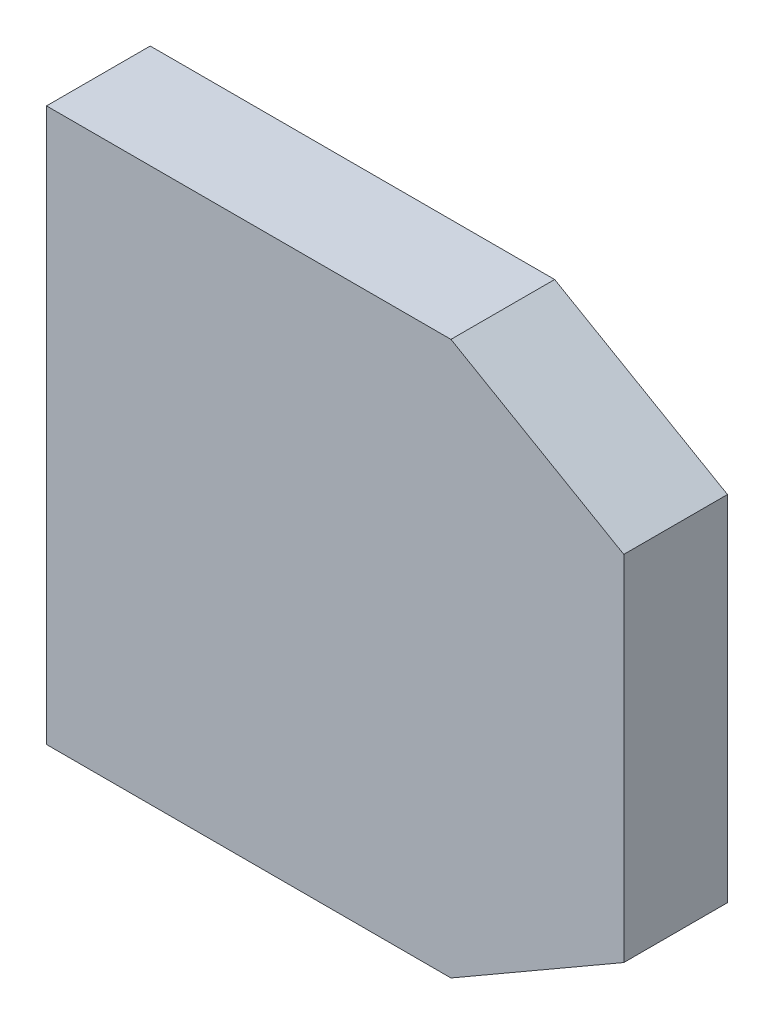
ISO-10303-21;
HEADER;
FILE_DESCRIPTION(('STEP AP214'),'2;1');
FILE_NAME('part.step','',(''),(''),'','','');
FILE_SCHEMA(('AUTOMOTIVE_DESIGN { 1 0 10303 214 1 1 1 1 }'));
ENDSEC;
DATA;
#1=APPLICATION_CONTEXT('core data for automotive mechanical design processes');
#2=APPLICATION_PROTOCOL_DEFINITION('international standard','automotive_design',2000,#1);
#3=PRODUCT_CONTEXT('',#1,'mechanical');
#4=PRODUCT('Part','Part','',(#3));
#5=PRODUCT_RELATED_PRODUCT_CATEGORY('part','',(#4));
#6=PRODUCT_DEFINITION_FORMATION('','',#4);
#7=PRODUCT_DEFINITION_CONTEXT('part definition',#1,'design');
#8=PRODUCT_DEFINITION('design','',#6,#7);
#9=PRODUCT_DEFINITION_SHAPE('','',#8);
#10=(LENGTH_UNIT() NAMED_UNIT(*) SI_UNIT(.MILLI.,.METRE.));
#11=(NAMED_UNIT(*) PLANE_ANGLE_UNIT() SI_UNIT($,.RADIAN.));
#12=(NAMED_UNIT(*) SI_UNIT($,.STERADIAN.) SOLID_ANGLE_UNIT());
#13=UNCERTAINTY_MEASURE_WITH_UNIT(LENGTH_MEASURE(1.E-05),#10,'distance_accuracy_value','');
#14=(GEOMETRIC_REPRESENTATION_CONTEXT(3) GLOBAL_UNCERTAINTY_ASSIGNED_CONTEXT((#13)) GLOBAL_UNIT_ASSIGNED_CONTEXT((#10,
#11,#12)) REPRESENTATION_CONTEXT('',''));
#15=CARTESIAN_POINT('',(0.,0.,0.));
#16=DIRECTION('',(0.,0.,1.));
#17=DIRECTION('',(1.,0.,0.));
#18=AXIS2_PLACEMENT_3D('',#15,#16,#17);
#19=CARTESIAN_POINT('',(0.,0.,0.));
#20=DIRECTION('',(0.,0.,1.));
#21=DIRECTION('',(1.,0.,0.));
#22=AXIS2_PLACEMENT_3D('',#19,#20,#21);
#23=PLANE('',#22);
#24=DIRECTION('',(0.,-1.,0.));
#25=VECTOR('',#24,1.);
#26=CARTESIAN_POINT('',(3.3000000000006,8.,0.));
#27=LINE('',#26,#25);
#28=CARTESIAN_POINT('',(3.3000000000006,8.,0.));
#29=VERTEX_POINT('',#28);
#30=CARTESIAN_POINT('',(3.3000000000006,-8.,0.));
#31=VERTEX_POINT('',#30);
#32=EDGE_CURVE('E100',#29,#31,#27,.T.);
#33=ORIENTED_EDGE('',*,*,#32,.F.);
#34=DIRECTION('',(-1.,0.,0.));
#35=VECTOR('',#34,1.);
#36=CARTESIAN_POINT('',(15.0000000000005,8.,0.));
#37=LINE('',#36,#35);
#38=CARTESIAN_POINT('',(15.0000000000005,8.,0.));
#39=VERTEX_POINT('',#38);
#40=EDGE_CURVE('E26',#39,#29,#37,.T.);
#41=ORIENTED_EDGE('',*,*,#40,.F.);
#42=DIRECTION('',(-0.86602540378444,0.5,0.));
#43=VECTOR('',#42,1.);
#44=CARTESIAN_POINT('',(20.0000000000006,5.11324865405187,0.));
#45=LINE('',#44,#43);
#46=CARTESIAN_POINT('',(20.0000000000006,5.11324865405187,0.));
#47=VERTEX_POINT('',#46);
#48=EDGE_CURVE('E117',#47,#39,#45,.T.);
#49=ORIENTED_EDGE('',*,*,#48,.F.);
#50=DIRECTION('',(0.,1.,0.));
#51=VECTOR('',#50,1.);
#52=CARTESIAN_POINT('',(20.0000000000006,-5.11324865405188,0.));
#53=LINE('',#52,#51);
#54=CARTESIAN_POINT('',(20.0000000000006,-5.11324865405188,0.));
#55=VERTEX_POINT('',#54);
#56=EDGE_CURVE('E147',#55,#47,#53,.T.);
#57=ORIENTED_EDGE('',*,*,#56,.F.);
#58=DIRECTION('',(0.866025403784441,0.5,0.));
#59=VECTOR('',#58,1.);
#60=CARTESIAN_POINT('',(15.0000000000005,-8.,0.));
#61=LINE('',#60,#59);
#62=CARTESIAN_POINT('',(15.0000000000005,-8.,0.));
#63=VERTEX_POINT('',#62);
#64=EDGE_CURVE('E135',#63,#55,#61,.T.);
#65=ORIENTED_EDGE('',*,*,#64,.F.);
#66=DIRECTION('',(1.,0.,0.));
#67=VECTOR('',#66,1.);
#68=CARTESIAN_POINT('',(3.3000000000006,-8.,0.));
#69=LINE('',#68,#67);
#70=EDGE_CURVE('E104',#31,#63,#69,.T.);
#71=ORIENTED_EDGE('',*,*,#70,.F.);
#72=EDGE_LOOP('',(#33,#41,#49,#57,#65,#71));
#73=FACE_BOUND('',#72,.T.);
#74=ADVANCED_FACE('F17',(#73),#23,.F.);
#75=CARTESIAN_POINT('',(0.,0.,3.));
#76=DIRECTION('',(0.,0.,1.));
#77=DIRECTION('',(1.,0.,0.));
#78=AXIS2_PLACEMENT_3D('',#75,#76,#77);
#79=PLANE('',#78);
#80=DIRECTION('',(0.,-1.,0.));
#81=VECTOR('',#80,1.);
#82=CARTESIAN_POINT('',(3.3000000000006,8.,3.));
#83=LINE('',#82,#81);
#84=CARTESIAN_POINT('',(3.3000000000006,8.,3.));
#85=VERTEX_POINT('',#84);
#86=CARTESIAN_POINT('',(3.3000000000006,-8.,3.));
#87=VERTEX_POINT('',#86);
#88=EDGE_CURVE('E102',#85,#87,#83,.T.);
#89=ORIENTED_EDGE('',*,*,#88,.T.);
#90=DIRECTION('',(1.,0.,0.));
#91=VECTOR('',#90,1.);
#92=CARTESIAN_POINT('',(3.3000000000006,-8.,3.));
#93=LINE('',#92,#91);
#94=CARTESIAN_POINT('',(15.0000000000005,-8.,3.));
#95=VERTEX_POINT('',#94);
#96=EDGE_CURVE('E127',#87,#95,#93,.T.);
#97=ORIENTED_EDGE('',*,*,#96,.T.);
#98=DIRECTION('',(0.866025403784441,0.5,0.));
#99=VECTOR('',#98,1.);
#100=CARTESIAN_POINT('',(15.0000000000005,-8.,3.));
#101=LINE('',#100,#99);
#102=CARTESIAN_POINT('',(20.0000000000006,-5.11324865405188,3.));
#103=VERTEX_POINT('',#102);
#104=EDGE_CURVE('E142',#95,#103,#101,.T.);
#105=ORIENTED_EDGE('',*,*,#104,.T.);
#106=DIRECTION('',(0.,1.,0.));
#107=VECTOR('',#106,1.);
#108=CARTESIAN_POINT('',(20.0000000000006,-5.11324865405188,3.));
#109=LINE('',#108,#107);
#110=CARTESIAN_POINT('',(20.0000000000006,5.11324865405187,3.));
#111=VERTEX_POINT('',#110);
#112=EDGE_CURVE('E120',#103,#111,#109,.T.);
#113=ORIENTED_EDGE('',*,*,#112,.T.);
#114=DIRECTION('',(-0.86602540378444,0.5,0.));
#115=VECTOR('',#114,1.);
#116=CARTESIAN_POINT('',(20.0000000000006,5.11324865405187,3.));
#117=LINE('',#116,#115);
#118=CARTESIAN_POINT('',(15.0000000000005,8.,3.));
#119=VERTEX_POINT('',#118);
#120=EDGE_CURVE('E94',#111,#119,#117,.T.);
#121=ORIENTED_EDGE('',*,*,#120,.T.);
#122=DIRECTION('',(-1.,0.,0.));
#123=VECTOR('',#122,1.);
#124=CARTESIAN_POINT('',(15.0000000000005,8.,3.));
#125=LINE('',#124,#123);
#126=EDGE_CURVE('E11',#119,#85,#125,.T.);
#127=ORIENTED_EDGE('',*,*,#126,.T.);
#128=EDGE_LOOP('',(#89,#97,#105,#113,#121,#127));
#129=FACE_BOUND('',#128,.T.);
#130=ADVANCED_FACE('F19',(#129),#79,.T.);
#131=CARTESIAN_POINT('',(15.0000000000005,8.,3.));
#132=DIRECTION('',(0.,-1.,0.));
#133=DIRECTION('',(0.,0.,-1.));
#134=AXIS2_PLACEMENT_3D('',#131,#132,#133);
#135=PLANE('',#134);
#136=ORIENTED_EDGE('',*,*,#40,.T.);
#137=DIRECTION('',(0.,0.,-1.));
#138=VECTOR('',#137,1.);
#139=CARTESIAN_POINT('',(3.3000000000006,8.,3.));
#140=LINE('',#139,#138);
#141=EDGE_CURVE('E88',#85,#29,#140,.T.);
#142=ORIENTED_EDGE('',*,*,#141,.F.);
#143=ORIENTED_EDGE('',*,*,#126,.F.);
#144=DIRECTION('',(0.,0.,-1.));
#145=VECTOR('',#144,1.);
#146=CARTESIAN_POINT('',(15.0000000000005,8.,3.));
#147=LINE('',#146,#145);
#148=EDGE_CURVE('E91',#119,#39,#147,.T.);
#149=ORIENTED_EDGE('',*,*,#148,.T.);
#150=EDGE_LOOP('',(#136,#142,#143,#149));
#151=FACE_BOUND('',#150,.T.);
#152=ADVANCED_FACE('F87',(#151),#135,.F.);
#153=CARTESIAN_POINT('',(20.0000000000006,5.11324865405187,3.));
#154=DIRECTION('',(-0.5,-0.86602540378444,0.));
#155=DIRECTION('',(-0.86602540378444,0.5,0.));
#156=AXIS2_PLACEMENT_3D('',#153,#154,#155);
#157=PLANE('',#156);
#158=ORIENTED_EDGE('',*,*,#48,.T.);
#159=ORIENTED_EDGE('',*,*,#148,.F.);
#160=ORIENTED_EDGE('',*,*,#120,.F.);
#161=DIRECTION('',(0.,0.,-1.));
#162=VECTOR('',#161,1.);
#163=CARTESIAN_POINT('',(20.0000000000006,5.11324865405187,3.));
#164=LINE('',#163,#162);
#165=EDGE_CURVE('E151',#111,#47,#164,.T.);
#166=ORIENTED_EDGE('',*,*,#165,.T.);
#167=EDGE_LOOP('',(#158,#159,#160,#166));
#168=FACE_BOUND('',#167,.T.);
#169=ADVANCED_FACE('F163',(#168),#157,.F.);
#170=CARTESIAN_POINT('',(20.0000000000006,-5.11324865405188,3.));
#171=DIRECTION('',(-1.,0.,0.));
#172=DIRECTION('',(0.,0.,1.));
#173=AXIS2_PLACEMENT_3D('',#170,#171,#172);
#174=PLANE('',#173);
#175=ORIENTED_EDGE('',*,*,#56,.T.);
#176=ORIENTED_EDGE('',*,*,#165,.F.);
#177=ORIENTED_EDGE('',*,*,#112,.F.);
#178=DIRECTION('',(0.,0.,-1.));
#179=VECTOR('',#178,1.);
#180=CARTESIAN_POINT('',(20.0000000000006,-5.11324865405188,3.));
#181=LINE('',#180,#179);
#182=EDGE_CURVE('E139',#103,#55,#181,.T.);
#183=ORIENTED_EDGE('',*,*,#182,.T.);
#184=EDGE_LOOP('',(#175,#176,#177,#183));
#185=FACE_BOUND('',#184,.T.);
#186=ADVANCED_FACE('F166',(#185),#174,.F.);
#187=CARTESIAN_POINT('',(15.0000000000005,-8.,3.));
#188=DIRECTION('',(-0.5,0.866025403784441,0.));
#189=DIRECTION('',(0.,0.,1.));
#190=AXIS2_PLACEMENT_3D('',#187,#188,#189);
#191=PLANE('',#190);
#192=ORIENTED_EDGE('',*,*,#64,.T.);
#193=ORIENTED_EDGE('',*,*,#182,.F.);
#194=ORIENTED_EDGE('',*,*,#104,.F.);
#195=DIRECTION('',(0.,0.,-1.));
#196=VECTOR('',#195,1.);
#197=CARTESIAN_POINT('',(15.0000000000005,-8.,3.));
#198=LINE('',#197,#196);
#199=EDGE_CURVE('E123',#95,#63,#198,.T.);
#200=ORIENTED_EDGE('',*,*,#199,.T.);
#201=EDGE_LOOP('',(#192,#193,#194,#200));
#202=FACE_BOUND('',#201,.T.);
#203=ADVANCED_FACE('F168',(#202),#191,.F.);
#204=CARTESIAN_POINT('',(3.3000000000006,-8.,3.));
#205=DIRECTION('',(0.,1.,0.));
#206=DIRECTION('',(1.,0.,0.));
#207=AXIS2_PLACEMENT_3D('',#204,#205,#206);
#208=PLANE('',#207);
#209=ORIENTED_EDGE('',*,*,#70,.T.);
#210=ORIENTED_EDGE('',*,*,#199,.F.);
#211=ORIENTED_EDGE('',*,*,#96,.F.);
#212=DIRECTION('',(0.,0.,-1.));
#213=VECTOR('',#212,1.);
#214=CARTESIAN_POINT('',(3.3000000000006,-8.,3.));
#215=LINE('',#214,#213);
#216=EDGE_CURVE('E109',#87,#31,#215,.T.);
#217=ORIENTED_EDGE('',*,*,#216,.T.);
#218=EDGE_LOOP('',(#209,#210,#211,#217));
#219=FACE_BOUND('',#218,.T.);
#220=ADVANCED_FACE('F171',(#219),#208,.F.);
#221=CARTESIAN_POINT('',(3.3000000000006,8.,3.));
#222=DIRECTION('',(1.,0.,0.));
#223=DIRECTION('',(0.,-1.,0.));
#224=AXIS2_PLACEMENT_3D('',#221,#222,#223);
#225=PLANE('',#224);
#226=ORIENTED_EDGE('',*,*,#32,.T.);
#227=ORIENTED_EDGE('',*,*,#216,.F.);
#228=ORIENTED_EDGE('',*,*,#88,.F.);
#229=ORIENTED_EDGE('',*,*,#141,.T.);
#230=EDGE_LOOP('',(#226,#227,#228,#229));
#231=FACE_BOUND('',#230,.T.);
#232=ADVANCED_FACE('F98',(#231),#225,.F.);
#233=CLOSED_SHELL('',(#74,#130,#152,#169,#186,#203,#220,#232));
#234=MANIFOLD_SOLID_BREP('B1',#233);
#235=ADVANCED_BREP_SHAPE_REPRESENTATION('',(#18,#234),#14);
#236=SHAPE_DEFINITION_REPRESENTATION(#9,#235);
ENDSEC;
END-ISO-10303-21;
